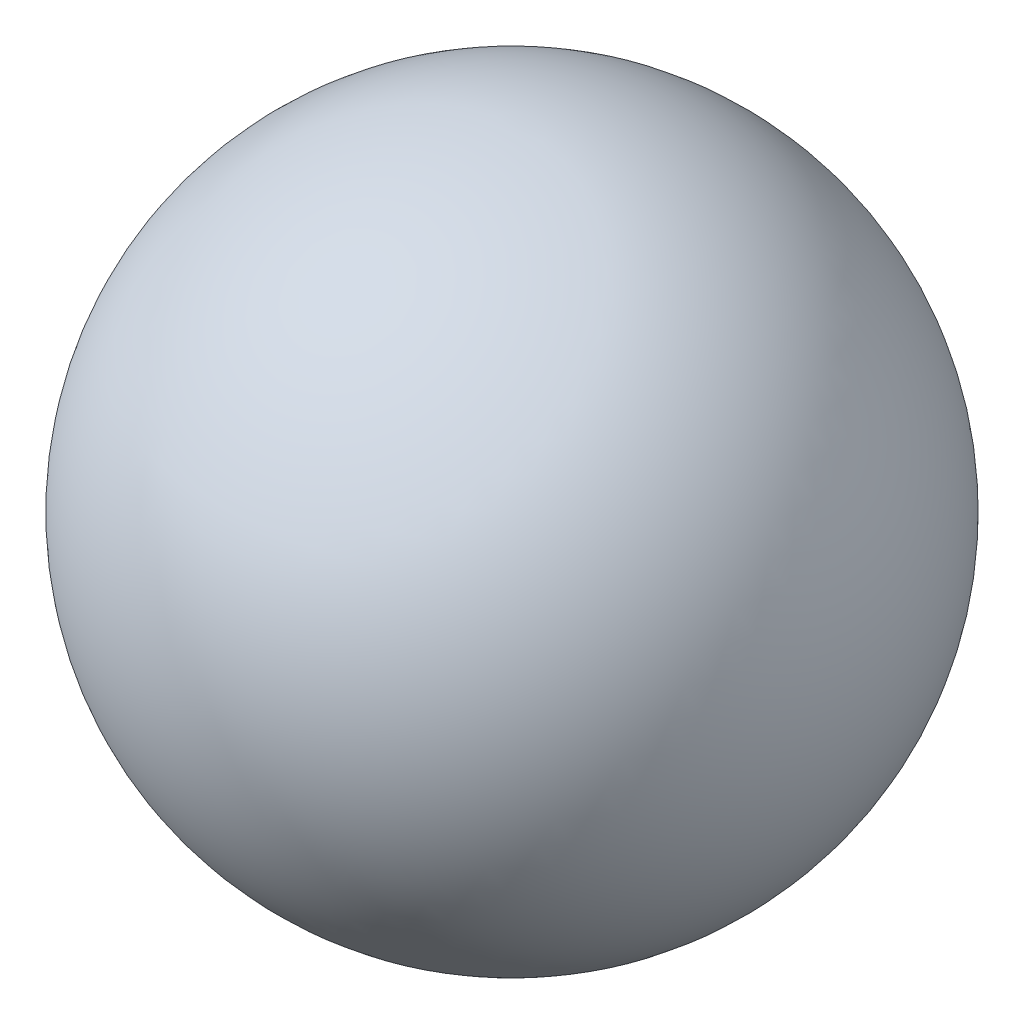
ISO-10303-21;
HEADER;
FILE_DESCRIPTION(('STEP AP214'),'2;1');
FILE_NAME('part.step','',(''),(''),'','','');
FILE_SCHEMA(('AUTOMOTIVE_DESIGN { 1 0 10303 214 1 1 1 1 }'));
ENDSEC;
DATA;
#1=APPLICATION_CONTEXT('core data for automotive mechanical design processes');
#2=APPLICATION_PROTOCOL_DEFINITION('international standard','automotive_design',2000,#1);
#3=PRODUCT_CONTEXT('',#1,'mechanical');
#4=PRODUCT('Part','Part','',(#3));
#5=PRODUCT_RELATED_PRODUCT_CATEGORY('part','',(#4));
#6=PRODUCT_DEFINITION_FORMATION('','',#4);
#7=PRODUCT_DEFINITION_CONTEXT('part definition',#1,'design');
#8=PRODUCT_DEFINITION('design','',#6,#7);
#9=PRODUCT_DEFINITION_SHAPE('','',#8);
#10=(LENGTH_UNIT() NAMED_UNIT(*) SI_UNIT(.MILLI.,.METRE.));
#11=(NAMED_UNIT(*) PLANE_ANGLE_UNIT() SI_UNIT($,.RADIAN.));
#12=(NAMED_UNIT(*) SI_UNIT($,.STERADIAN.) SOLID_ANGLE_UNIT());
#13=UNCERTAINTY_MEASURE_WITH_UNIT(LENGTH_MEASURE(1.E-05),#10,'distance_accuracy_value','');
#14=(GEOMETRIC_REPRESENTATION_CONTEXT(3) GLOBAL_UNCERTAINTY_ASSIGNED_CONTEXT((#13)) GLOBAL_UNIT_ASSIGNED_CONTEXT((#10,
#11,#12)) REPRESENTATION_CONTEXT('',''));
#15=CARTESIAN_POINT('',(0.,0.,0.));
#16=DIRECTION('',(0.,0.,1.));
#17=DIRECTION('',(1.,0.,0.));
#18=AXIS2_PLACEMENT_3D('',#15,#16,#17);
#19=CARTESIAN_POINT('',(0.,0.,0.));
#20=DIRECTION('',(0.,-1.,0.));
#21=DIRECTION('',(-1.,0.,0.));
#22=AXIS2_PLACEMENT_3D('',#19,#20,#21);
#23=SPHERICAL_SURFACE('',#22,1.75);
#24=CARTESIAN_POINT('',(0.,-1.75,0.));
#25=VERTEX_POINT('',#24);
#26=VERTEX_LOOP('',#25);
#27=FACE_BOUND('',#26,.T.);
#28=ADVANCED_FACE('F28',(#27),#23,.T.);
#29=CLOSED_SHELL('',(#28));
#30=MANIFOLD_SOLID_BREP('B2',#29);
#31=ADVANCED_BREP_SHAPE_REPRESENTATION('',(#18,#30),#14);
#32=SHAPE_DEFINITION_REPRESENTATION(#9,#31);
ENDSEC;
END-ISO-10303-21;
